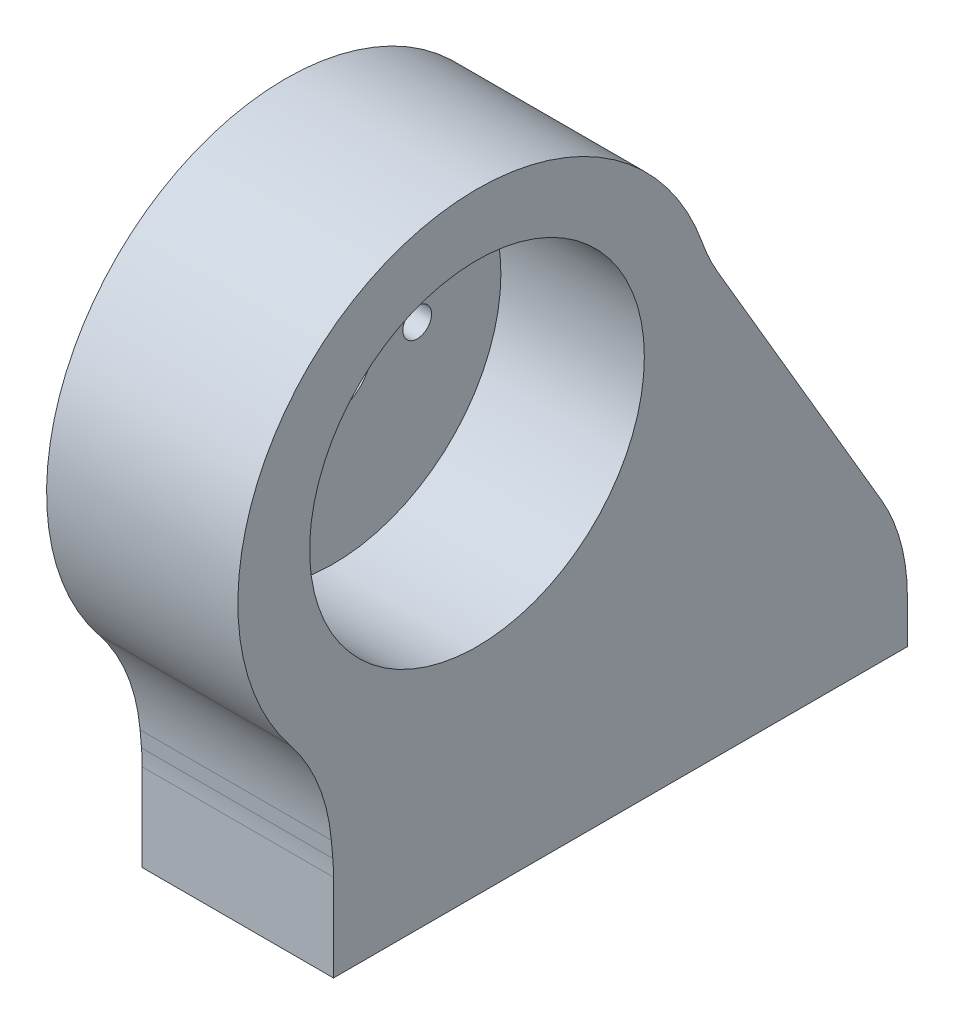
ISO-10303-21;
HEADER;
FILE_DESCRIPTION(('STEP AP214'),'2;1');
FILE_NAME('part.step','',(''),(''),'','','');
FILE_SCHEMA(('AUTOMOTIVE_DESIGN { 1 0 10303 214 1 1 1 1 }'));
ENDSEC;
DATA;
#1=APPLICATION_CONTEXT('core data for automotive mechanical design processes');
#2=APPLICATION_PROTOCOL_DEFINITION('international standard','automotive_design',2000,#1);
#3=PRODUCT_CONTEXT('',#1,'mechanical');
#4=PRODUCT('Part','Part','',(#3));
#5=PRODUCT_RELATED_PRODUCT_CATEGORY('part','',(#4));
#6=PRODUCT_DEFINITION_FORMATION('','',#4);
#7=PRODUCT_DEFINITION_CONTEXT('part definition',#1,'design');
#8=PRODUCT_DEFINITION('design','',#6,#7);
#9=PRODUCT_DEFINITION_SHAPE('','',#8);
#10=(LENGTH_UNIT() NAMED_UNIT(*) SI_UNIT(.MILLI.,.METRE.));
#11=(NAMED_UNIT(*) PLANE_ANGLE_UNIT() SI_UNIT($,.RADIAN.));
#12=(NAMED_UNIT(*) SI_UNIT($,.STERADIAN.) SOLID_ANGLE_UNIT());
#13=UNCERTAINTY_MEASURE_WITH_UNIT(LENGTH_MEASURE(1.E-05),#10,'distance_accuracy_value','');
#14=(GEOMETRIC_REPRESENTATION_CONTEXT(3) GLOBAL_UNCERTAINTY_ASSIGNED_CONTEXT((#13)) GLOBAL_UNIT_ASSIGNED_CONTEXT((#10,
#11,#12)) REPRESENTATION_CONTEXT('',''));
#15=CARTESIAN_POINT('',(0.,0.,0.));
#16=DIRECTION('',(0.,0.,1.));
#17=DIRECTION('',(1.,0.,0.));
#18=AXIS2_PLACEMENT_3D('',#15,#16,#17);
#19=CARTESIAN_POINT('',(-21.,35.,6.25));
#20=DIRECTION('',(1.,0.,0.));
#21=DIRECTION('',(0.,0.,-1.));
#22=AXIS2_PLACEMENT_3D('',#19,#20,#21);
#23=CYLINDRICAL_SURFACE('',#22,1.5);
#24=CARTESIAN_POINT('',(-15.,35.,6.25));
#25=DIRECTION('',(1.,0.,0.));
#26=DIRECTION('',(0.,0.,-1.));
#27=AXIS2_PLACEMENT_3D('',#24,#25,#26);
#28=CIRCLE('',#27,1.5);
#29=CARTESIAN_POINT('',(-15.,35.,4.75));
#30=VERTEX_POINT('',#29);
#31=EDGE_CURVE('E255',#30,#30,#28,.T.);
#32=ORIENTED_EDGE('',*,*,#31,.T.);
#33=EDGE_LOOP('',(#32));
#34=FACE_BOUND('',#33,.T.);
#35=CARTESIAN_POINT('',(-18.,35.,6.25));
#36=DIRECTION('',(-1.,0.,0.));
#37=DIRECTION('',(0.,0.,1.));
#38=AXIS2_PLACEMENT_3D('',#35,#36,#37);
#39=CIRCLE('',#38,1.5);
#40=CARTESIAN_POINT('',(-18.,35.,7.75));
#41=VERTEX_POINT('',#40);
#42=EDGE_CURVE('E47',#41,#41,#39,.F.);
#43=ORIENTED_EDGE('',*,*,#42,.F.);
#44=EDGE_LOOP('',(#43));
#45=FACE_BOUND('',#44,.T.);
#46=ADVANCED_FACE('F44',(#34,#45),#23,.F.);
#47=CARTESIAN_POINT('',(-21.,35.,23.75));
#48=DIRECTION('',(1.,0.,0.));
#49=DIRECTION('',(0.,0.,-1.));
#50=AXIS2_PLACEMENT_3D('',#47,#48,#49);
#51=CYLINDRICAL_SURFACE('',#50,1.5);
#52=CARTESIAN_POINT('',(-15.,35.,23.75));
#53=DIRECTION('',(1.,0.,0.));
#54=DIRECTION('',(0.,0.,-1.));
#55=AXIS2_PLACEMENT_3D('',#52,#53,#54);
#56=CIRCLE('',#55,1.5);
#57=CARTESIAN_POINT('',(-15.,35.,22.25));
#58=VERTEX_POINT('',#57);
#59=EDGE_CURVE('E237',#58,#58,#56,.T.);
#60=ORIENTED_EDGE('',*,*,#59,.T.);
#61=EDGE_LOOP('',(#60));
#62=FACE_BOUND('',#61,.T.);
#63=CARTESIAN_POINT('',(-18.,35.,23.75));
#64=DIRECTION('',(-1.,0.,0.));
#65=DIRECTION('',(0.,0.,1.));
#66=AXIS2_PLACEMENT_3D('',#63,#64,#65);
#67=CIRCLE('',#66,1.5);
#68=CARTESIAN_POINT('',(-18.,35.,25.25));
#69=VERTEX_POINT('',#68);
#70=EDGE_CURVE('E227',#69,#69,#67,.F.);
#71=ORIENTED_EDGE('',*,*,#70,.F.);
#72=EDGE_LOOP('',(#71));
#73=FACE_BOUND('',#72,.T.);
#74=ADVANCED_FACE('F316',(#62,#73),#51,.F.);
#75=CARTESIAN_POINT('',(-20.,-5.,-30.));
#76=DIRECTION('',(0.,0.,-1.));
#77=DIRECTION('',(-1.,0.,0.));
#78=AXIS2_PLACEMENT_3D('',#75,#76,#77);
#79=PLANE('',#78);
#80=DIRECTION('',(0.,1.,0.));
#81=VECTOR('',#80,1.);
#82=CARTESIAN_POINT('',(0.,-5.,-30.));
#83=LINE('',#82,#81);
#84=CARTESIAN_POINT('',(0.,-5.,-30.));
#85=VERTEX_POINT('',#84);
#86=CARTESIAN_POINT('',(0.,-0.428270657664018,-30.));
#87=VERTEX_POINT('',#86);
#88=EDGE_CURVE('E165',#85,#87,#83,.T.);
#89=ORIENTED_EDGE('',*,*,#88,.F.);
#90=DIRECTION('',(1.,0.,0.));
#91=VECTOR('',#90,1.);
#92=CARTESIAN_POINT('',(-20.,-5.,-30.));
#93=LINE('',#92,#91);
#94=CARTESIAN_POINT('',(-20.,-5.,-30.));
#95=VERTEX_POINT('',#94);
#96=EDGE_CURVE('E11',#95,#85,#93,.T.);
#97=ORIENTED_EDGE('',*,*,#96,.F.);
#98=DIRECTION('',(0.,1.,0.));
#99=VECTOR('',#98,1.);
#100=CARTESIAN_POINT('',(-20.,-5.,-30.));
#101=LINE('',#100,#99);
#102=CARTESIAN_POINT('',(-20.,-0.428270657664018,-30.));
#103=VERTEX_POINT('',#102);
#104=EDGE_CURVE('E200',#95,#103,#101,.T.);
#105=ORIENTED_EDGE('',*,*,#104,.T.);
#106=DIRECTION('',(1.,0.,0.));
#107=VECTOR('',#106,1.);
#108=CARTESIAN_POINT('',(-20.,-0.428270657664018,-30.));
#109=LINE('',#108,#107);
#110=EDGE_CURVE('E108',#103,#87,#109,.T.);
#111=ORIENTED_EDGE('',*,*,#110,.T.);
#112=EDGE_LOOP('',(#89,#97,#105,#111));
#113=FACE_BOUND('',#112,.T.);
#114=ADVANCED_FACE('F50',(#113),#79,.T.);
#115=CARTESIAN_POINT('',(-20.,-5.,-30.));
#116=DIRECTION('',(0.,-1.,0.));
#117=DIRECTION('',(0.,0.,-1.));
#118=AXIS2_PLACEMENT_3D('',#115,#116,#117);
#119=PLANE('',#118);
#120=DIRECTION('',(0.,0.,-1.));
#121=VECTOR('',#120,1.);
#122=CARTESIAN_POINT('',(0.,-5.,-30.));
#123=LINE('',#122,#121);
#124=CARTESIAN_POINT('',(0.,-5.00000000000001,30.));
#125=VERTEX_POINT('',#124);
#126=EDGE_CURVE('E198',#125,#85,#123,.T.);
#127=ORIENTED_EDGE('',*,*,#126,.F.);
#128=DIRECTION('',(1.,0.,0.));
#129=VECTOR('',#128,1.);
#130=CARTESIAN_POINT('',(-20.,-5.00000000000001,30.));
#131=LINE('',#130,#129);
#132=CARTESIAN_POINT('',(-20.,-5.00000000000001,30.));
#133=VERTEX_POINT('',#132);
#134=EDGE_CURVE('E57',#133,#125,#131,.T.);
#135=ORIENTED_EDGE('',*,*,#134,.F.);
#136=DIRECTION('',(0.,0.,-1.));
#137=VECTOR('',#136,1.);
#138=CARTESIAN_POINT('',(-20.,-5.,-30.));
#139=LINE('',#138,#137);
#140=EDGE_CURVE('E146',#133,#95,#139,.T.);
#141=ORIENTED_EDGE('',*,*,#140,.T.);
#142=ORIENTED_EDGE('',*,*,#96,.T.);
#143=EDGE_LOOP('',(#127,#135,#141,#142));
#144=FACE_BOUND('',#143,.T.);
#145=ADVANCED_FACE('F306',(#144),#119,.T.);
#146=CARTESIAN_POINT('',(-20.,-5.00000000000001,30.));
#147=DIRECTION('',(0.,0.,1.));
#148=DIRECTION('',(1.,0.,0.));
#149=AXIS2_PLACEMENT_3D('',#146,#147,#148);
#150=PLANE('',#149);
#151=DIRECTION('',(0.,-1.,0.));
#152=VECTOR('',#151,1.);
#153=CARTESIAN_POINT('',(0.,-5.00000000000001,30.));
#154=LINE('',#153,#152);
#155=CARTESIAN_POINT('',(0.,4.12658013372461,30.));
#156=VERTEX_POINT('',#155);
#157=EDGE_CURVE('E133',#156,#125,#154,.T.);
#158=ORIENTED_EDGE('',*,*,#157,.F.);
#159=DIRECTION('',(1.,0.,0.));
#160=VECTOR('',#159,1.);
#161=CARTESIAN_POINT('',(-20.,4.12658013372461,30.));
#162=LINE('',#161,#160);
#163=CARTESIAN_POINT('',(-20.,4.12658013372461,30.));
#164=VERTEX_POINT('',#163);
#165=EDGE_CURVE('E129',#164,#156,#162,.T.);
#166=ORIENTED_EDGE('',*,*,#165,.F.);
#167=DIRECTION('',(0.,-1.,0.));
#168=VECTOR('',#167,1.);
#169=CARTESIAN_POINT('',(-20.,-5.00000000000001,30.));
#170=LINE('',#169,#168);
#171=EDGE_CURVE('E132',#164,#133,#170,.T.);
#172=ORIENTED_EDGE('',*,*,#171,.T.);
#173=ORIENTED_EDGE('',*,*,#134,.T.);
#174=EDGE_LOOP('',(#158,#166,#172,#173));
#175=FACE_BOUND('',#174,.T.);
#176=ADVANCED_FACE('F131',(#175),#150,.T.);
#177=CARTESIAN_POINT('',(-20.,4.1265801337247,50.));
#178=DIRECTION('',(1.,0.,0.));
#179=DIRECTION('',(0.,0.,-1.));
#180=AXIS2_PLACEMENT_3D('',#177,#178,#179);
#181=CYLINDRICAL_SURFACE('',#180,20.);
#182=CARTESIAN_POINT('',(0.,4.1265801337247,50.));
#183=DIRECTION('',(-1.,0.,0.));
#184=DIRECTION('',(0.,0.,-1.));
#185=AXIS2_PLACEMENT_3D('',#182,#183,#184);
#186=CIRCLE('',#185,20.);
#187=CARTESIAN_POINT('',(0.,5.87009471258322,30.0761410135158));
#188=VERTEX_POINT('',#187);
#189=EDGE_CURVE('E193',#188,#156,#186,.T.);
#190=ORIENTED_EDGE('',*,*,#189,.F.);
#191=DIRECTION('',(1.,0.,0.));
#192=VECTOR('',#191,1.);
#193=CARTESIAN_POINT('',(-20.,5.87009471258322,30.0761410135158));
#194=LINE('',#193,#192);
#195=CARTESIAN_POINT('',(-20.,5.87009471258322,30.0761410135158));
#196=VERTEX_POINT('',#195);
#197=EDGE_CURVE('E139',#196,#188,#194,.T.);
#198=ORIENTED_EDGE('',*,*,#197,.F.);
#199=CARTESIAN_POINT('',(-20.,4.1265801337247,50.));
#200=DIRECTION('',(-1.,0.,0.));
#201=DIRECTION('',(0.,0.,-1.));
#202=AXIS2_PLACEMENT_3D('',#199,#200,#201);
#203=CIRCLE('',#202,20.);
#204=EDGE_CURVE('E148',#196,#164,#203,.T.);
#205=ORIENTED_EDGE('',*,*,#204,.T.);
#206=ORIENTED_EDGE('',*,*,#165,.T.);
#207=EDGE_LOOP('',(#190,#198,#205,#206));
#208=FACE_BOUND('',#207,.T.);
#209=ADVANCED_FACE('F151',(#208),#181,.F.);
#210=CARTESIAN_POINT('',(-20.,5.87009471258323,30.0761410135158));
#211=DIRECTION('',(0.,-0.0871757289429252,0.996192949324211));
#212=DIRECTION('',(0.,-0.996192949324211,-0.0871757289429252));
#213=AXIS2_PLACEMENT_3D('',#210,#211,#212);
#214=PLANE('',#213);
#215=DIRECTION('',(0.,-0.996192949324211,-0.0871757289429252));
#216=VECTOR('',#215,1.);
#217=CARTESIAN_POINT('',(0.,5.87009471258323,30.0761410135158));
#218=LINE('',#217,#216);
#219=CARTESIAN_POINT('',(0.,7.58587882465292,30.22628735894));
#220=VERTEX_POINT('',#219);
#221=EDGE_CURVE('E187',#220,#188,#218,.T.);
#222=ORIENTED_EDGE('',*,*,#221,.F.);
#223=DIRECTION('',(1.,0.,0.));
#224=VECTOR('',#223,1.);
#225=CARTESIAN_POINT('',(-20.,7.58587882465292,30.22628735894));
#226=LINE('',#225,#224);
#227=CARTESIAN_POINT('',(-20.,7.58587882465292,30.22628735894));
#228=VERTEX_POINT('',#227);
#229=EDGE_CURVE('E202',#228,#220,#226,.T.);
#230=ORIENTED_EDGE('',*,*,#229,.F.);
#231=DIRECTION('',(0.,-0.996192949324211,-0.0871757289429252));
#232=VECTOR('',#231,1.);
#233=CARTESIAN_POINT('',(-20.,5.87009471258323,30.0761410135158));
#234=LINE('',#233,#232);
#235=EDGE_CURVE('E153',#228,#196,#234,.T.);
#236=ORIENTED_EDGE('',*,*,#235,.T.);
#237=ORIENTED_EDGE('',*,*,#197,.T.);
#238=EDGE_LOOP('',(#222,#230,#236,#237));
#239=FACE_BOUND('',#238,.T.);
#240=ADVANCED_FACE('F469',(#239),#214,.T.);
#241=CARTESIAN_POINT('',(-20.,5.84236424579444,50.1501463454242));
#242=DIRECTION('',(1.,0.,0.));
#243=DIRECTION('',(0.,0.,-1.));
#244=AXIS2_PLACEMENT_3D('',#241,#242,#243);
#245=CYLINDRICAL_SURFACE('',#244,20.);
#246=CARTESIAN_POINT('',(0.,5.84236424579444,50.1501463454242));
#247=DIRECTION('',(-1.,0.,0.));
#248=DIRECTION('',(0.,0.,-1.));
#249=AXIS2_PLACEMENT_3D('',#246,#247,#248);
#250=CIRCLE('',#249,20.);
#251=CARTESIAN_POINT('',(0.,18.3301238775813,34.5278590807912));
#252=VERTEX_POINT('',#251);
#253=EDGE_CURVE('E181',#252,#220,#250,.T.);
#254=ORIENTED_EDGE('',*,*,#253,.F.);
#255=DIRECTION('',(1.,0.,0.));
#256=VECTOR('',#255,1.);
#257=CARTESIAN_POINT('',(-20.,18.3301238775813,34.5278590807912));
#258=LINE('',#257,#256);
#259=CARTESIAN_POINT('',(-20.,18.3301238775813,34.5278590807912));
#260=VERTEX_POINT('',#259);
#261=EDGE_CURVE('E208',#260,#252,#258,.T.);
#262=ORIENTED_EDGE('',*,*,#261,.F.);
#263=CARTESIAN_POINT('',(-20.,5.84236424579444,50.1501463454242));
#264=DIRECTION('',(-1.,0.,0.));
#265=DIRECTION('',(0.,0.,-1.));
#266=AXIS2_PLACEMENT_3D('',#263,#264,#265);
#267=CIRCLE('',#266,20.);
#268=EDGE_CURVE('E156',#260,#228,#267,.T.);
#269=ORIENTED_EDGE('',*,*,#268,.T.);
#270=ORIENTED_EDGE('',*,*,#229,.T.);
#271=EDGE_LOOP('',(#254,#262,#269,#270));
#272=FACE_BOUND('',#271,.T.);
#273=ADVANCED_FACE('F292',(#272),#245,.F.);
#274=CARTESIAN_POINT('',(-20.,33.939823417315,15.));
#275=DIRECTION('',(1.,0.,0.));
#276=DIRECTION('',(0.,0.,-1.));
#277=AXIS2_PLACEMENT_3D('',#274,#275,#276);
#278=CYLINDRICAL_SURFACE('',#277,25.);
#279=CARTESIAN_POINT('',(0.,33.939823417315,15.));
#280=DIRECTION('',(1.,0.,0.));
#281=DIRECTION('',(0.,0.,-1.));
#282=AXIS2_PLACEMENT_3D('',#279,#280,#281);
#283=CIRCLE('',#282,25.);
#284=CARTESIAN_POINT('',(0.,42.2875994693221,-8.56511478829537));
#285=VERTEX_POINT('',#284);
#286=EDGE_CURVE('E177',#285,#252,#283,.T.);
#287=ORIENTED_EDGE('',*,*,#286,.F.);
#288=DIRECTION('',(1.,0.,0.));
#289=VECTOR('',#288,1.);
#290=CARTESIAN_POINT('',(-20.,42.2875994693221,-8.56511478829537));
#291=LINE('',#290,#289);
#292=CARTESIAN_POINT('',(-20.,42.2875994693221,-8.56511478829537));
#293=VERTEX_POINT('',#292);
#294=EDGE_CURVE('E211',#293,#285,#291,.T.);
#295=ORIENTED_EDGE('',*,*,#294,.F.);
#296=CARTESIAN_POINT('',(-20.,33.939823417315,15.));
#297=DIRECTION('',(1.,0.,0.));
#298=DIRECTION('',(0.,0.,-1.));
#299=AXIS2_PLACEMENT_3D('',#296,#297,#298);
#300=CIRCLE('',#299,25.);
#301=EDGE_CURVE('E284',#293,#260,#300,.T.);
#302=ORIENTED_EDGE('',*,*,#301,.T.);
#303=ORIENTED_EDGE('',*,*,#261,.T.);
#304=EDGE_LOOP('',(#287,#295,#302,#303));
#305=FACE_BOUND('',#304,.T.);
#306=ADVANCED_FACE('F297',(#305),#278,.T.);
#307=CARTESIAN_POINT('',(-20.,48.9658203109278,-27.4172066189317));
#308=DIRECTION('',(1.,0.,0.));
#309=DIRECTION('',(0.,0.,-1.));
#310=AXIS2_PLACEMENT_3D('',#307,#308,#309);
#311=CYLINDRICAL_SURFACE('',#310,20.);
#312=CARTESIAN_POINT('',(0.,48.9658203109278,-27.4172066189317));
#313=DIRECTION('',(-1.,0.,0.));
#314=DIRECTION('',(0.,0.,1.));
#315=AXIS2_PLACEMENT_3D('',#312,#313,#314);
#316=CIRCLE('',#315,20.);
#317=CARTESIAN_POINT('',(0.,38.8541577133238,-10.1616486878703));
#318=VERTEX_POINT('',#317);
#319=EDGE_CURVE('E175',#318,#285,#316,.T.);
#320=ORIENTED_EDGE('',*,*,#319,.F.);
#321=DIRECTION('',(1.,0.,0.));
#322=VECTOR('',#321,1.);
#323=CARTESIAN_POINT('',(-20.,38.8541577133238,-10.1616486878703));
#324=LINE('',#323,#322);
#325=CARTESIAN_POINT('',(-20.,38.8541577133238,-10.1616486878703));
#326=VERTEX_POINT('',#325);
#327=EDGE_CURVE('E212',#326,#318,#324,.T.);
#328=ORIENTED_EDGE('',*,*,#327,.F.);
#329=CARTESIAN_POINT('',(-20.,48.9658203109278,-27.4172066189317));
#330=DIRECTION('',(-1.,0.,0.));
#331=DIRECTION('',(0.,0.,1.));
#332=AXIS2_PLACEMENT_3D('',#329,#330,#331);
#333=CIRCLE('',#332,20.);
#334=EDGE_CURVE('E276',#326,#293,#333,.T.);
#335=ORIENTED_EDGE('',*,*,#334,.T.);
#336=ORIENTED_EDGE('',*,*,#294,.T.);
#337=EDGE_LOOP('',(#320,#328,#335,#336));
#338=FACE_BOUND('',#337,.T.);
#339=ADVANCED_FACE('F300',(#338),#311,.F.);
#340=CARTESIAN_POINT('',(-20.,9.68339193994013,-27.2555579310614));
#341=DIRECTION('',(0.,0.5055831298802,-0.86277789655307));
#342=DIRECTION('',(0.,0.86277789655307,0.5055831298802));
#343=AXIS2_PLACEMENT_3D('',#340,#341,#342);
#344=PLANE('',#343);
#345=DIRECTION('',(0.,0.86277789655307,0.5055831298802));
#346=VECTOR('',#345,1.);
#347=CARTESIAN_POINT('',(0.,9.68339193994013,-27.2555579310614));
#348=LINE('',#347,#346);
#349=CARTESIAN_POINT('',(0.,9.68339193994013,-27.2555579310614));
#350=VERTEX_POINT('',#349);
#351=EDGE_CURVE('E171',#350,#318,#348,.T.);
#352=ORIENTED_EDGE('',*,*,#351,.F.);
#353=DIRECTION('',(1.,0.,0.));
#354=VECTOR('',#353,1.);
#355=CARTESIAN_POINT('',(-20.,9.68339193994013,-27.2555579310614));
#356=LINE('',#355,#354);
#357=CARTESIAN_POINT('',(-20.,9.68339193994013,-27.2555579310614));
#358=VERTEX_POINT('',#357);
#359=EDGE_CURVE('E220',#358,#350,#356,.T.);
#360=ORIENTED_EDGE('',*,*,#359,.F.);
#361=DIRECTION('',(0.,0.86277789655307,0.5055831298802));
#362=VECTOR('',#361,1.);
#363=CARTESIAN_POINT('',(-20.,9.68339193994013,-27.2555579310614));
#364=LINE('',#363,#362);
#365=EDGE_CURVE('E274',#358,#326,#364,.T.);
#366=ORIENTED_EDGE('',*,*,#365,.T.);
#367=ORIENTED_EDGE('',*,*,#327,.T.);
#368=EDGE_LOOP('',(#352,#360,#366,#367));
#369=FACE_BOUND('',#368,.T.);
#370=ADVANCED_FACE('F302',(#369),#344,.T.);
#371=CARTESIAN_POINT('',(-20.,-0.428270657663947,-9.99999999999999));
#372=DIRECTION('',(1.,0.,0.));
#373=DIRECTION('',(0.,0.,-1.));
#374=AXIS2_PLACEMENT_3D('',#371,#372,#373);
#375=CYLINDRICAL_SURFACE('',#374,20.);
#376=CARTESIAN_POINT('',(0.,-0.428270657663947,-9.99999999999999));
#377=DIRECTION('',(1.,0.,0.));
#378=DIRECTION('',(0.,0.,-1.));
#379=AXIS2_PLACEMENT_3D('',#376,#377,#378);
#380=CIRCLE('',#379,20.);
#381=EDGE_CURVE('E167',#87,#350,#380,.T.);
#382=ORIENTED_EDGE('',*,*,#381,.F.);
#383=ORIENTED_EDGE('',*,*,#110,.F.);
#384=CARTESIAN_POINT('',(-20.,-0.428270657663947,-9.99999999999999));
#385=DIRECTION('',(1.,0.,0.));
#386=DIRECTION('',(0.,0.,-1.));
#387=AXIS2_PLACEMENT_3D('',#384,#385,#386);
#388=CIRCLE('',#387,20.);
#389=EDGE_CURVE('E275',#103,#358,#388,.T.);
#390=ORIENTED_EDGE('',*,*,#389,.T.);
#391=ORIENTED_EDGE('',*,*,#359,.T.);
#392=EDGE_LOOP('',(#382,#383,#390,#391));
#393=FACE_BOUND('',#392,.T.);
#394=ADVANCED_FACE('F304',(#393),#375,.T.);
#395=CARTESIAN_POINT('',(-20.,-0.428270657663947,-9.99999999999999));
#396=DIRECTION('',(1.,0.,0.));
#397=DIRECTION('',(0.,0.,-1.));
#398=AXIS2_PLACEMENT_3D('',#395,#396,#397);
#399=PLANE('',#398);
#400=CARTESIAN_POINT('',(-20.,35.,6.25));
#401=DIRECTION('',(-1.,0.,0.));
#402=DIRECTION('',(0.,0.,1.));
#403=AXIS2_PLACEMENT_3D('',#400,#401,#402);
#404=CIRCLE('',#403,3.);
#405=CARTESIAN_POINT('',(-20.,35.,9.25));
#406=VERTEX_POINT('',#405);
#407=EDGE_CURVE('E236',#406,#406,#404,.T.);
#408=ORIENTED_EDGE('',*,*,#407,.F.);
#409=EDGE_LOOP('',(#408));
#410=FACE_BOUND('',#409,.T.);
#411=CARTESIAN_POINT('',(-20.,35.,23.75));
#412=DIRECTION('',(-1.,0.,0.));
#413=DIRECTION('',(0.,0.,1.));
#414=AXIS2_PLACEMENT_3D('',#411,#412,#413);
#415=CIRCLE('',#414,3.);
#416=CARTESIAN_POINT('',(-20.,35.,26.75));
#417=VERTEX_POINT('',#416);
#418=EDGE_CURVE('E243',#417,#417,#415,.T.);
#419=ORIENTED_EDGE('',*,*,#418,.F.);
#420=EDGE_LOOP('',(#419));
#421=FACE_BOUND('',#420,.T.);
#422=CARTESIAN_POINT('',(-20.,35.,15.));
#423=DIRECTION('',(1.,0.,0.));
#424=DIRECTION('',(0.,0.,-1.));
#425=AXIS2_PLACEMENT_3D('',#422,#423,#424);
#426=CIRCLE('',#425,4.);
#427=CARTESIAN_POINT('',(-20.,35.,11.));
#428=VERTEX_POINT('',#427);
#429=EDGE_CURVE('E225',#428,#428,#426,.T.);
#430=ORIENTED_EDGE('',*,*,#429,.T.);
#431=EDGE_LOOP('',(#430));
#432=FACE_BOUND('',#431,.T.);
#433=ORIENTED_EDGE('',*,*,#104,.F.);
#434=ORIENTED_EDGE('',*,*,#140,.F.);
#435=ORIENTED_EDGE('',*,*,#171,.F.);
#436=ORIENTED_EDGE('',*,*,#204,.F.);
#437=ORIENTED_EDGE('',*,*,#235,.F.);
#438=ORIENTED_EDGE('',*,*,#268,.F.);
#439=ORIENTED_EDGE('',*,*,#301,.F.);
#440=ORIENTED_EDGE('',*,*,#334,.F.);
#441=ORIENTED_EDGE('',*,*,#365,.F.);
#442=ORIENTED_EDGE('',*,*,#389,.F.);
#443=EDGE_LOOP('',(#433,#434,#435,#436,#437,#438,#439,#440,#441,#442));
#444=FACE_BOUND('',#443,.T.);
#445=ADVANCED_FACE('F145',(#410,#421,#432,#444),#399,.F.);
#446=CARTESIAN_POINT('',(0.,-0.428270657663947,-9.99999999999999));
#447=DIRECTION('',(1.,0.,0.));
#448=DIRECTION('',(0.,0.,-1.));
#449=AXIS2_PLACEMENT_3D('',#446,#447,#448);
#450=PLANE('',#449);
#451=CARTESIAN_POINT('',(0.,35.,15.));
#452=DIRECTION('',(1.,0.,0.));
#453=DIRECTION('',(0.,0.,-1.));
#454=AXIS2_PLACEMENT_3D('',#451,#452,#453);
#455=CIRCLE('',#454,17.5);
#456=CARTESIAN_POINT('',(0.,35.,-2.5));
#457=VERTEX_POINT('',#456);
#458=EDGE_CURVE('E223',#457,#457,#455,.T.);
#459=ORIENTED_EDGE('',*,*,#458,.F.);
#460=EDGE_LOOP('',(#459));
#461=FACE_BOUND('',#460,.T.);
#462=ORIENTED_EDGE('',*,*,#88,.T.);
#463=ORIENTED_EDGE('',*,*,#381,.T.);
#464=ORIENTED_EDGE('',*,*,#351,.T.);
#465=ORIENTED_EDGE('',*,*,#319,.T.);
#466=ORIENTED_EDGE('',*,*,#286,.T.);
#467=ORIENTED_EDGE('',*,*,#253,.T.);
#468=ORIENTED_EDGE('',*,*,#221,.T.);
#469=ORIENTED_EDGE('',*,*,#189,.T.);
#470=ORIENTED_EDGE('',*,*,#157,.T.);
#471=ORIENTED_EDGE('',*,*,#126,.T.);
#472=EDGE_LOOP('',(#462,#463,#464,#465,#466,#467,#468,#469,#470,#471));
#473=FACE_BOUND('',#472,.T.);
#474=ADVANCED_FACE('F307',(#461,#473),#450,.T.);
#475=CARTESIAN_POINT('',(-15.,35.,15.));
#476=DIRECTION('',(1.,0.,0.));
#477=DIRECTION('',(0.,0.,-1.));
#478=AXIS2_PLACEMENT_3D('',#475,#476,#477);
#479=CYLINDRICAL_SURFACE('',#478,17.5);
#480=CARTESIAN_POINT('',(-15.,35.,15.));
#481=DIRECTION('',(1.,0.,0.));
#482=DIRECTION('',(0.,0.,-1.));
#483=AXIS2_PLACEMENT_3D('',#480,#481,#482);
#484=CIRCLE('',#483,17.5);
#485=CARTESIAN_POINT('',(-15.,35.,-2.5));
#486=VERTEX_POINT('',#485);
#487=EDGE_CURVE('E170',#486,#486,#484,.T.);
#488=ORIENTED_EDGE('',*,*,#487,.F.);
#489=EDGE_LOOP('',(#488));
#490=FACE_BOUND('',#489,.T.);
#491=ORIENTED_EDGE('',*,*,#458,.T.);
#492=EDGE_LOOP('',(#491));
#493=FACE_BOUND('',#492,.T.);
#494=ADVANCED_FACE('F339',(#490,#493),#479,.F.);
#495=CARTESIAN_POINT('',(-15.,35.,15.));
#496=DIRECTION('',(1.,0.,0.));
#497=DIRECTION('',(0.,0.,-1.));
#498=AXIS2_PLACEMENT_3D('',#495,#496,#497);
#499=PLANE('',#498);
#500=ORIENTED_EDGE('',*,*,#59,.F.);
#501=EDGE_LOOP('',(#500));
#502=FACE_BOUND('',#501,.T.);
#503=ORIENTED_EDGE('',*,*,#31,.F.);
#504=EDGE_LOOP('',(#503));
#505=FACE_BOUND('',#504,.T.);
#506=CARTESIAN_POINT('',(-15.,35.,15.));
#507=DIRECTION('',(1.,0.,0.));
#508=DIRECTION('',(0.,0.,-1.));
#509=AXIS2_PLACEMENT_3D('',#506,#507,#508);
#510=CIRCLE('',#509,4.);
#511=CARTESIAN_POINT('',(-15.,35.,11.));
#512=VERTEX_POINT('',#511);
#513=EDGE_CURVE('E226',#512,#512,#510,.T.);
#514=ORIENTED_EDGE('',*,*,#513,.F.);
#515=EDGE_LOOP('',(#514));
#516=FACE_BOUND('',#515,.T.);
#517=ORIENTED_EDGE('',*,*,#487,.T.);
#518=EDGE_LOOP('',(#517));
#519=FACE_BOUND('',#518,.T.);
#520=ADVANCED_FACE('F331',(#502,#505,#516,#519),#499,.T.);
#521=CARTESIAN_POINT('',(-21.,35.,15.));
#522=DIRECTION('',(1.,0.,0.));
#523=DIRECTION('',(0.,0.,-1.));
#524=AXIS2_PLACEMENT_3D('',#521,#522,#523);
#525=CYLINDRICAL_SURFACE('',#524,4.);
#526=ORIENTED_EDGE('',*,*,#513,.T.);
#527=EDGE_LOOP('',(#526));
#528=FACE_BOUND('',#527,.T.);
#529=ORIENTED_EDGE('',*,*,#429,.F.);
#530=EDGE_LOOP('',(#529));
#531=FACE_BOUND('',#530,.T.);
#532=ADVANCED_FACE('F335',(#528,#531),#525,.F.);
#533=CARTESIAN_POINT('',(-18.,35.,23.75));
#534=DIRECTION('',(-1.,0.,0.));
#535=DIRECTION('',(0.,0.,1.));
#536=AXIS2_PLACEMENT_3D('',#533,#534,#535);
#537=PLANE('',#536);
#538=CARTESIAN_POINT('',(-18.,35.,23.75));
#539=DIRECTION('',(-1.,0.,0.));
#540=DIRECTION('',(0.,0.,1.));
#541=AXIS2_PLACEMENT_3D('',#538,#539,#540);
#542=CIRCLE('',#541,3.);
#543=CARTESIAN_POINT('',(-18.,35.,26.75));
#544=VERTEX_POINT('',#543);
#545=EDGE_CURVE('E249',#544,#544,#542,.T.);
#546=ORIENTED_EDGE('',*,*,#545,.T.);
#547=EDGE_LOOP('',(#546));
#548=FACE_BOUND('',#547,.T.);
#549=ORIENTED_EDGE('',*,*,#70,.T.);
#550=EDGE_LOOP('',(#549));
#551=FACE_BOUND('',#550,.T.);
#552=ADVANCED_FACE('F328',(#548,#551),#537,.T.);
#553=CARTESIAN_POINT('',(-18.,35.,23.75));
#554=DIRECTION('',(-1.,0.,0.));
#555=DIRECTION('',(0.,0.,1.));
#556=AXIS2_PLACEMENT_3D('',#553,#554,#555);
#557=CYLINDRICAL_SURFACE('',#556,3.);
#558=ORIENTED_EDGE('',*,*,#545,.F.);
#559=EDGE_LOOP('',(#558));
#560=FACE_BOUND('',#559,.T.);
#561=ORIENTED_EDGE('',*,*,#418,.T.);
#562=EDGE_LOOP('',(#561));
#563=FACE_BOUND('',#562,.T.);
#564=ADVANCED_FACE('F388',(#560,#563),#557,.F.);
#565=CARTESIAN_POINT('',(-18.,35.,6.25));
#566=DIRECTION('',(-1.,0.,0.));
#567=DIRECTION('',(0.,0.,1.));
#568=AXIS2_PLACEMENT_3D('',#565,#566,#567);
#569=PLANE('',#568);
#570=CARTESIAN_POINT('',(-18.,35.,6.25));
#571=DIRECTION('',(-1.,0.,0.));
#572=DIRECTION('',(0.,0.,1.));
#573=AXIS2_PLACEMENT_3D('',#570,#571,#572);
#574=CIRCLE('',#573,3.);
#575=CARTESIAN_POINT('',(-18.,35.,9.25));
#576=VERTEX_POINT('',#575);
#577=EDGE_CURVE('E230',#576,#576,#574,.T.);
#578=ORIENTED_EDGE('',*,*,#577,.T.);
#579=EDGE_LOOP('',(#578));
#580=FACE_BOUND('',#579,.T.);
#581=ORIENTED_EDGE('',*,*,#42,.T.);
#582=EDGE_LOOP('',(#581));
#583=FACE_BOUND('',#582,.T.);
#584=ADVANCED_FACE('F397',(#580,#583),#569,.T.);
#585=CARTESIAN_POINT('',(-18.,35.,6.25));
#586=DIRECTION('',(-1.,0.,0.));
#587=DIRECTION('',(0.,0.,1.));
#588=AXIS2_PLACEMENT_3D('',#585,#586,#587);
#589=CYLINDRICAL_SURFACE('',#588,3.);
#590=ORIENTED_EDGE('',*,*,#577,.F.);
#591=EDGE_LOOP('',(#590));
#592=FACE_BOUND('',#591,.T.);
#593=ORIENTED_EDGE('',*,*,#407,.T.);
#594=EDGE_LOOP('',(#593));
#595=FACE_BOUND('',#594,.T.);
#596=ADVANCED_FACE('F409',(#592,#595),#589,.F.);
#597=CLOSED_SHELL('',(#46,#74,#114,#145,#176,#209,#240,#273,#306,#339,#370,#394,#445,#474,#494,
#520,#532,#552,#564,#584,#596));
#598=MANIFOLD_SOLID_BREP('B2',#597);
#599=ADVANCED_BREP_SHAPE_REPRESENTATION('',(#18,#598),#14);
#600=SHAPE_DEFINITION_REPRESENTATION(#9,#599);
ENDSEC;
END-ISO-10303-21;
